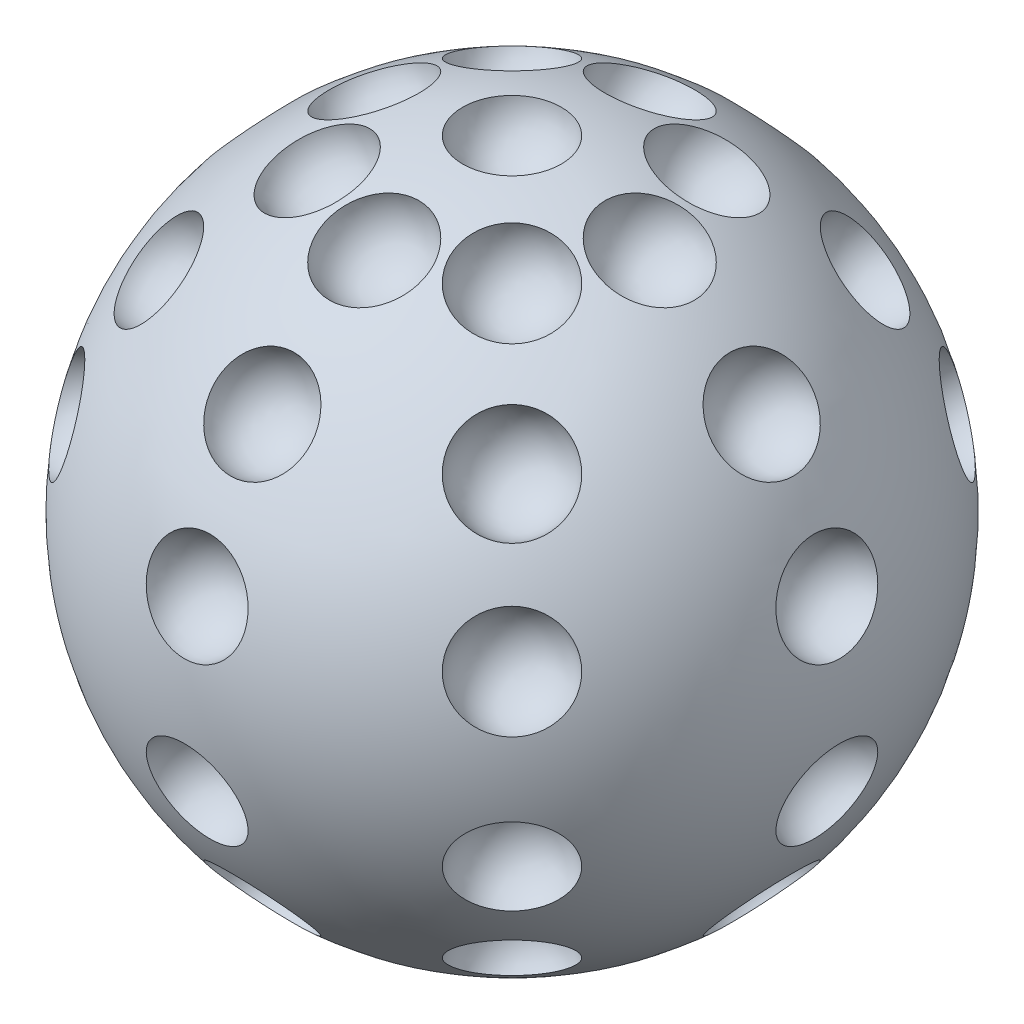
ISO-10303-21;
HEADER;
FILE_DESCRIPTION(('STEP AP214'),'2;1');
FILE_NAME('part.step','',(''),(''),'','','');
FILE_SCHEMA(('AUTOMOTIVE_DESIGN { 1 0 10303 214 1 1 1 1 }'));
ENDSEC;
DATA;
#1=APPLICATION_CONTEXT('core data for automotive mechanical design processes');
#2=APPLICATION_PROTOCOL_DEFINITION('international standard','automotive_design',2000,#1);
#3=PRODUCT_CONTEXT('',#1,'mechanical');
#4=PRODUCT('Part','Part','',(#3));
#5=PRODUCT_RELATED_PRODUCT_CATEGORY('part','',(#4));
#6=PRODUCT_DEFINITION_FORMATION('','',#4);
#7=PRODUCT_DEFINITION_CONTEXT('part definition',#1,'design');
#8=PRODUCT_DEFINITION('design','',#6,#7);
#9=PRODUCT_DEFINITION_SHAPE('','',#8);
#10=(LENGTH_UNIT() NAMED_UNIT(*) SI_UNIT(.MILLI.,.METRE.));
#11=(NAMED_UNIT(*) PLANE_ANGLE_UNIT() SI_UNIT($,.RADIAN.));
#12=(NAMED_UNIT(*) SI_UNIT($,.STERADIAN.) SOLID_ANGLE_UNIT());
#13=UNCERTAINTY_MEASURE_WITH_UNIT(LENGTH_MEASURE(1.E-05),#10,'distance_accuracy_value','');
#14=(GEOMETRIC_REPRESENTATION_CONTEXT(3) GLOBAL_UNCERTAINTY_ASSIGNED_CONTEXT((#13)) GLOBAL_UNIT_ASSIGNED_CONTEXT((#10,
#11,#12)) REPRESENTATION_CONTEXT('',''));
#15=CARTESIAN_POINT('',(0.,0.,0.));
#16=DIRECTION('',(0.,0.,1.));
#17=DIRECTION('',(1.,0.,0.));
#18=AXIS2_PLACEMENT_3D('',#15,#16,#17);
#19=CARTESIAN_POINT('',(0.,0.,0.));
#20=DIRECTION('',(0.,-1.,0.));
#21=DIRECTION('',(-1.,0.,0.));
#22=AXIS2_PLACEMENT_3D('',#19,#20,#21);
#23=SPHERICAL_SURFACE('',#22,20.);
#24=CARTESIAN_POINT('',(0.,19.775,0.));
#25=DIRECTION('',(0.,-1.,0.));
#26=DIRECTION('',(0.,0.,-1.));
#27=AXIS2_PLACEMENT_3D('',#24,#25,#26);
#28=CIRCLE('',#27,2.99155060127687);
#29=CARTESIAN_POINT('',(0.,19.775,-2.99155060127687));
#30=VERTEX_POINT('',#29);
#31=EDGE_CURVE('E10',#30,#30,#28,.T.);
#32=ORIENTED_EDGE('',*,*,#31,.T.);
#33=EDGE_LOOP('',(#32));
#34=FACE_BOUND('',#33,.T.);
#35=CARTESIAN_POINT('',(0.,17.9222364886498,8.35727612592235));
#36=DIRECTION('',(0.,-0.90630778703665,-0.4226182617407));
#37=DIRECTION('',(0.,0.4226182617407,-0.90630778703665));
#38=AXIS2_PLACEMENT_3D('',#35,#36,#37);
#39=CIRCLE('',#38,2.99155060127687);
#40=CARTESIAN_POINT('',(0.,19.1865204036707,5.64601052067095));
#41=VERTEX_POINT('',#40);
#42=EDGE_CURVE('E50',#41,#41,#39,.T.);
#43=ORIENTED_EDGE('',*,*,#42,.T.);
#44=EDGE_LOOP('',(#43));
#45=FACE_BOUND('',#44,.T.);
#46=CARTESIAN_POINT('',(0.,12.7111249815513,15.1485288626778));
#47=DIRECTION('',(0.,-0.642787609686538,-0.766044443118979));
#48=DIRECTION('',(0.,0.766044443118979,-0.642787609686538));
#49=AXIS2_PLACEMENT_3D('',#46,#47,#48);
#50=CIRCLE('',#49,2.99155060127687);
#51=CARTESIAN_POINT('',(0.,15.0027856959687,13.2255972024267));
#52=VERTEX_POINT('',#51);
#53=EDGE_CURVE('E55',#52,#52,#50,.T.);
#54=ORIENTED_EDGE('',*,*,#53,.T.);
#55=EDGE_LOOP('',(#54));
#56=FACE_BOUND('',#55,.T.);
#57=CARTESIAN_POINT('',(0.,5.1181466169023,19.1011832148663));
#58=DIRECTION('',(0.,-0.258819045102518,-0.965925826289069));
#59=DIRECTION('',(0.,0.965925826289069,-0.258819045102518));
#60=AXIS2_PLACEMENT_3D('',#57,#58,#59);
#61=CIRCLE('',#60,2.99155060127687);
#62=CARTESIAN_POINT('',(0.,8.00776260332622,18.326912944868));
#63=VERTEX_POINT('',#62);
#64=EDGE_CURVE('E60',#63,#63,#61,.T.);
#65=ORIENTED_EDGE('',*,*,#64,.T.);
#66=EDGE_LOOP('',(#65));
#67=FACE_BOUND('',#66,.T.);
#68=CARTESIAN_POINT('',(-5.90948662088814,17.9222364886497,5.90948662088812));
#69=DIRECTION('',(0.298836238730121,-0.90630778703665,-0.29883623873012));
#70=DIRECTION('',(0.640856382055789,0.4226182617407,-0.640856382055787));
#71=AXIS2_PLACEMENT_3D('',#68,#69,#70);
#72=CIRCLE('',#71,2.99155060127687);
#73=CARTESIAN_POINT('',(-3.99233232581702,19.1865204036707,3.99233232581701));
#74=VERTEX_POINT('',#73);
#75=EDGE_CURVE('E66',#74,#74,#72,.T.);
#76=ORIENTED_EDGE('',*,*,#75,.T.);
#77=EDGE_LOOP('',(#76));
#78=FACE_BOUND('',#77,.T.);
#79=CARTESIAN_POINT('',(-10.7116274837996,12.7111249815513,10.7116274837996));
#80=DIRECTION('',(0.541675220419704,-0.642787609686538,-0.541675220419702));
#81=DIRECTION('',(0.454519477672044,0.766044443118979,-0.454519477672042));
#82=AXIS2_PLACEMENT_3D('',#79,#80,#81);
#83=CIRCLE('',#82,2.99155060127687);
#84=CARTESIAN_POINT('',(-9.35190946707779,15.0027856959687,9.35190946707776));
#85=VERTEX_POINT('',#84);
#86=EDGE_CURVE('E70',#85,#85,#83,.T.);
#87=ORIENTED_EDGE('',*,*,#86,.T.);
#88=EDGE_LOOP('',(#87));
#89=FACE_BOUND('',#88,.T.);
#90=CARTESIAN_POINT('',(-13.5065761799187,5.1181466169023,13.5065761799186));
#91=DIRECTION('',(0.683012701892221,-0.258819045102518,-0.683012701892219));
#92=DIRECTION('',(0.183012701892218,0.965925826289069,-0.183012701892217));
#93=AXIS2_PLACEMENT_3D('',#90,#91,#92);
#94=CIRCLE('',#93,2.99155060127687);
#95=CARTESIAN_POINT('',(-12.9590844215317,8.00776260332622,12.9590844215317));
#96=VERTEX_POINT('',#95);
#97=EDGE_CURVE('E74',#96,#96,#94,.T.);
#98=ORIENTED_EDGE('',*,*,#97,.T.);
#99=EDGE_LOOP('',(#98));
#100=FACE_BOUND('',#99,.T.);
#101=CARTESIAN_POINT('',(-8.35727612592235,17.9222364886498,0.));
#102=DIRECTION('',(0.4226182617407,-0.90630778703665,0.));
#103=DIRECTION('',(0.90630778703665,0.4226182617407,0.));
#104=AXIS2_PLACEMENT_3D('',#101,#102,#103);
#105=CIRCLE('',#104,2.99155060127687);
#106=CARTESIAN_POINT('',(-5.64601052067095,19.1865204036707,0.));
#107=VERTEX_POINT('',#106);
#108=EDGE_CURVE('E78',#107,#107,#105,.T.);
#109=ORIENTED_EDGE('',*,*,#108,.T.);
#110=EDGE_LOOP('',(#109));
#111=FACE_BOUND('',#110,.T.);
#112=CARTESIAN_POINT('',(-15.1485288626778,12.7111249815513,0.));
#113=DIRECTION('',(0.766044443118979,-0.642787609686538,0.));
#114=DIRECTION('',(0.642787609686538,0.766044443118979,0.));
#115=AXIS2_PLACEMENT_3D('',#112,#113,#114);
#116=CIRCLE('',#115,2.99155060127687);
#117=CARTESIAN_POINT('',(-13.2255972024267,15.0027856959687,0.));
#118=VERTEX_POINT('',#117);
#119=EDGE_CURVE('E82',#118,#118,#116,.T.);
#120=ORIENTED_EDGE('',*,*,#119,.T.);
#121=EDGE_LOOP('',(#120));
#122=FACE_BOUND('',#121,.T.);
#123=CARTESIAN_POINT('',(-19.1011832148663,5.1181466169023,0.));
#124=DIRECTION('',(0.965925826289069,-0.258819045102518,0.));
#125=DIRECTION('',(0.258819045102518,0.965925826289069,0.));
#126=AXIS2_PLACEMENT_3D('',#123,#124,#125);
#127=CIRCLE('',#126,2.99155060127687);
#128=CARTESIAN_POINT('',(-18.326912944868,8.00776260332622,0.));
#129=VERTEX_POINT('',#128);
#130=EDGE_CURVE('E86',#129,#129,#127,.T.);
#131=ORIENTED_EDGE('',*,*,#130,.T.);
#132=EDGE_LOOP('',(#131));
#133=FACE_BOUND('',#132,.T.);
#134=CARTESIAN_POINT('',(-5.9094866208881,17.9222364886497,-5.90948662088816));
#135=DIRECTION('',(0.298836238730119,-0.90630778703665,0.298836238730122));
#136=DIRECTION('',(0.640856382055785,0.4226182617407,0.640856382055792));
#137=AXIS2_PLACEMENT_3D('',#134,#135,#136);
#138=CIRCLE('',#137,2.99155060127687);
#139=CARTESIAN_POINT('',(-3.992332325817,19.1865204036707,-3.99233232581704));
#140=VERTEX_POINT('',#139);
#141=EDGE_CURVE('E90',#140,#140,#138,.T.);
#142=ORIENTED_EDGE('',*,*,#141,.T.);
#143=EDGE_LOOP('',(#142));
#144=FACE_BOUND('',#143,.T.);
#145=CARTESIAN_POINT('',(-10.7116274837996,12.7111249815513,-10.7116274837997));
#146=DIRECTION('',(0.5416752204197,-0.642787609686538,0.541675220419706));
#147=DIRECTION('',(0.45451947767204,0.766044443118979,0.454519477672045));
#148=AXIS2_PLACEMENT_3D('',#145,#146,#147);
#149=CIRCLE('',#148,2.99155060127687);
#150=CARTESIAN_POINT('',(-9.35190946707772,15.0027856959687,-9.35190946707782));
#151=VERTEX_POINT('',#150);
#152=EDGE_CURVE('E94',#151,#151,#149,.T.);
#153=ORIENTED_EDGE('',*,*,#152,.T.);
#154=EDGE_LOOP('',(#153));
#155=FACE_BOUND('',#154,.T.);
#156=CARTESIAN_POINT('',(-13.5065761799186,5.1181466169023,-13.5065761799187));
#157=DIRECTION('',(0.683012701892216,-0.258819045102518,0.683012701892223));
#158=DIRECTION('',(0.183012701892217,0.965925826289069,0.183012701892219));
#159=AXIS2_PLACEMENT_3D('',#156,#157,#158);
#160=CIRCLE('',#159,2.99155060127687);
#161=CARTESIAN_POINT('',(-12.9590844215316,8.00776260332622,-12.9590844215317));
#162=VERTEX_POINT('',#161);
#163=EDGE_CURVE('E98',#162,#162,#160,.T.);
#164=ORIENTED_EDGE('',*,*,#163,.T.);
#165=EDGE_LOOP('',(#164));
#166=FACE_BOUND('',#165,.T.);
#167=CARTESIAN_POINT('',(0.,17.9222364886498,-8.35727612592235));
#168=DIRECTION('',(0.,-0.90630778703665,0.4226182617407));
#169=DIRECTION('',(0.,0.4226182617407,0.90630778703665));
#170=AXIS2_PLACEMENT_3D('',#167,#168,#169);
#171=CIRCLE('',#170,2.99155060127687);
#172=CARTESIAN_POINT('',(0.,19.1865204036707,-5.64601052067095));
#173=VERTEX_POINT('',#172);
#174=EDGE_CURVE('E102',#173,#173,#171,.T.);
#175=ORIENTED_EDGE('',*,*,#174,.T.);
#176=EDGE_LOOP('',(#175));
#177=FACE_BOUND('',#176,.T.);
#178=CARTESIAN_POINT('',(0.,12.7111249815513,-15.1485288626778));
#179=DIRECTION('',(0.,-0.642787609686538,0.766044443118979));
#180=DIRECTION('',(0.,0.766044443118979,0.642787609686538));
#181=AXIS2_PLACEMENT_3D('',#178,#179,#180);
#182=CIRCLE('',#181,2.99155060127687);
#183=CARTESIAN_POINT('',(0.,15.0027856959687,-13.2255972024267));
#184=VERTEX_POINT('',#183);
#185=EDGE_CURVE('E106',#184,#184,#182,.T.);
#186=ORIENTED_EDGE('',*,*,#185,.T.);
#187=EDGE_LOOP('',(#186));
#188=FACE_BOUND('',#187,.T.);
#189=CARTESIAN_POINT('',(0.,5.1181466169023,-19.1011832148663));
#190=DIRECTION('',(0.,-0.258819045102518,0.965925826289069));
#191=DIRECTION('',(0.,0.965925826289069,0.258819045102518));
#192=AXIS2_PLACEMENT_3D('',#189,#190,#191);
#193=CIRCLE('',#192,2.99155060127687);
#194=CARTESIAN_POINT('',(0.,8.00776260332622,-18.326912944868));
#195=VERTEX_POINT('',#194);
#196=EDGE_CURVE('E110',#195,#195,#193,.T.);
#197=ORIENTED_EDGE('',*,*,#196,.T.);
#198=EDGE_LOOP('',(#197));
#199=FACE_BOUND('',#198,.T.);
#200=CARTESIAN_POINT('',(5.90948662088818,17.9222364886498,-5.90948662088808));
#201=DIRECTION('',(-0.298836238730123,-0.90630778703665,0.298836238730118));
#202=DIRECTION('',(-0.640856382055794,0.4226182617407,0.640856382055783));
#203=AXIS2_PLACEMENT_3D('',#200,#201,#202);
#204=CIRCLE('',#203,2.99155060127687);
#205=CARTESIAN_POINT('',(3.99233232581705,19.1865204036707,-3.99233232581698));
#206=VERTEX_POINT('',#205);
#207=EDGE_CURVE('E114',#206,#206,#204,.T.);
#208=ORIENTED_EDGE('',*,*,#207,.T.);
#209=EDGE_LOOP('',(#208));
#210=FACE_BOUND('',#209,.T.);
#211=CARTESIAN_POINT('',(10.7116274837997,12.7111249815513,-10.7116274837995));
#212=DIRECTION('',(-0.541675220419707,-0.642787609686538,0.541675220419698));
#213=DIRECTION('',(-0.454519477672047,0.766044443118979,0.454519477672039));
#214=AXIS2_PLACEMENT_3D('',#211,#212,#213);
#215=CIRCLE('',#214,2.99155060127687);
#216=CARTESIAN_POINT('',(9.35190946707785,15.0027856959687,-9.35190946707769));
#217=VERTEX_POINT('',#216);
#218=EDGE_CURVE('E118',#217,#217,#215,.T.);
#219=ORIENTED_EDGE('',*,*,#218,.T.);
#220=EDGE_LOOP('',(#219));
#221=FACE_BOUND('',#220,.T.);
#222=CARTESIAN_POINT('',(13.5065761799188,5.1181466169023,-13.5065761799185));
#223=DIRECTION('',(-0.683012701892226,-0.258819045102518,0.683012701892214));
#224=DIRECTION('',(-0.183012701892219,0.965925826289069,0.183012701892216));
#225=AXIS2_PLACEMENT_3D('',#222,#223,#224);
#226=CIRCLE('',#225,2.99155060127687);
#227=CARTESIAN_POINT('',(12.9590844215318,8.00776260332622,-12.9590844215316));
#228=VERTEX_POINT('',#227);
#229=EDGE_CURVE('E122',#228,#228,#226,.T.);
#230=ORIENTED_EDGE('',*,*,#229,.T.);
#231=EDGE_LOOP('',(#230));
#232=FACE_BOUND('',#231,.T.);
#233=CARTESIAN_POINT('',(8.35727612592235,17.9222364886498,0.));
#234=DIRECTION('',(-0.4226182617407,-0.90630778703665,0.));
#235=DIRECTION('',(-0.90630778703665,0.4226182617407,0.));
#236=AXIS2_PLACEMENT_3D('',#233,#234,#235);
#237=CIRCLE('',#236,2.99155060127687);
#238=CARTESIAN_POINT('',(5.64601052067095,19.1865204036707,0.));
#239=VERTEX_POINT('',#238);
#240=EDGE_CURVE('E126',#239,#239,#237,.T.);
#241=ORIENTED_EDGE('',*,*,#240,.T.);
#242=EDGE_LOOP('',(#241));
#243=FACE_BOUND('',#242,.T.);
#244=CARTESIAN_POINT('',(15.1485288626778,12.7111249815513,1.58672417504899E-13));
#245=DIRECTION('',(-0.766044443118979,-0.642787609686538,0.));
#246=DIRECTION('',(-0.642787609686538,0.766044443118979,0.));
#247=AXIS2_PLACEMENT_3D('',#244,#245,#246);
#248=CIRCLE('',#247,2.99155060127687);
#249=CARTESIAN_POINT('',(13.2255972024267,15.0027856959687,1.38530777481987E-13));
#250=VERTEX_POINT('',#249);
#251=EDGE_CURVE('E130',#250,#250,#248,.T.);
#252=ORIENTED_EDGE('',*,*,#251,.T.);
#253=EDGE_LOOP('',(#252));
#254=FACE_BOUND('',#253,.T.);
#255=CARTESIAN_POINT('',(19.1011832148663,5.1181466169023,2.00074274233589E-13));
#256=DIRECTION('',(-0.965925826289069,-0.258819045102518,0.));
#257=DIRECTION('',(-0.258819045102518,0.965925826289069,0.));
#258=AXIS2_PLACEMENT_3D('',#255,#256,#257);
#259=CIRCLE('',#258,2.99155060127687);
#260=CARTESIAN_POINT('',(18.326912944868,8.00776260332622,1.91964223636828E-13));
#261=VERTEX_POINT('',#260);
#262=EDGE_CURVE('E134',#261,#261,#259,.T.);
#263=ORIENTED_EDGE('',*,*,#262,.T.);
#264=EDGE_LOOP('',(#263));
#265=FACE_BOUND('',#264,.T.);
#266=CARTESIAN_POINT('',(5.90948662088806,17.9222364886498,5.9094866208882));
#267=DIRECTION('',(-0.298836238730117,-0.90630778703665,-0.298836238730124));
#268=DIRECTION('',(-0.640856382055781,0.4226182617407,-0.640856382055796));
#269=AXIS2_PLACEMENT_3D('',#266,#267,#268);
#270=CIRCLE('',#269,2.99155060127687);
#271=CARTESIAN_POINT('',(3.99233232581697,19.1865204036707,3.99233232581707));
#272=VERTEX_POINT('',#271);
#273=EDGE_CURVE('E138',#272,#272,#270,.T.);
#274=ORIENTED_EDGE('',*,*,#273,.T.);
#275=EDGE_LOOP('',(#274));
#276=FACE_BOUND('',#275,.T.);
#277=CARTESIAN_POINT('',(10.7116274837995,12.7111249815513,10.7116274837998));
#278=DIRECTION('',(-0.541675220419696,-0.642787609686538,-0.541675220419709));
#279=DIRECTION('',(-0.454519477672037,0.766044443118979,-0.454519477672048));
#280=AXIS2_PLACEMENT_3D('',#277,#278,#279);
#281=CIRCLE('',#280,2.99155060127687);
#282=CARTESIAN_POINT('',(9.35190946707766,15.0027856959687,9.35190946707788));
#283=VERTEX_POINT('',#282);
#284=EDGE_CURVE('E142',#283,#283,#281,.T.);
#285=ORIENTED_EDGE('',*,*,#284,.T.);
#286=EDGE_LOOP('',(#285));
#287=FACE_BOUND('',#286,.T.);
#288=CARTESIAN_POINT('',(13.5065761799185,5.1181466169023,13.5065761799188));
#289=DIRECTION('',(-0.683012701892212,-0.258819045102518,-0.683012701892228));
#290=DIRECTION('',(-0.183012701892215,0.965925826289069,-0.18301270189222));
#291=AXIS2_PLACEMENT_3D('',#288,#289,#290);
#292=CIRCLE('',#291,2.99155060127687);
#293=CARTESIAN_POINT('',(12.9590844215315,8.00776260332622,12.9590844215318));
#294=VERTEX_POINT('',#293);
#295=EDGE_CURVE('E146',#294,#294,#292,.T.);
#296=ORIENTED_EDGE('',*,*,#295,.T.);
#297=EDGE_LOOP('',(#296));
#298=FACE_BOUND('',#297,.T.);
#299=CARTESIAN_POINT('',(0.,-19.775,0.));
#300=DIRECTION('',(0.,-1.,0.));
#301=DIRECTION('',(0.,0.,-1.));
#302=AXIS2_PLACEMENT_3D('',#299,#300,#301);
#303=CIRCLE('',#302,2.99155060127687);
#304=CARTESIAN_POINT('',(0.,-19.775,-2.99155060127687));
#305=VERTEX_POINT('',#304);
#306=EDGE_CURVE('E150',#305,#305,#303,.T.);
#307=ORIENTED_EDGE('',*,*,#306,.F.);
#308=EDGE_LOOP('',(#307));
#309=FACE_BOUND('',#308,.T.);
#310=CARTESIAN_POINT('',(0.,-17.9222364886498,8.35727612592235));
#311=DIRECTION('',(0.,-0.90630778703665,0.4226182617407));
#312=DIRECTION('',(0.,-0.4226182617407,-0.90630778703665));
#313=AXIS2_PLACEMENT_3D('',#310,#311,#312);
#314=CIRCLE('',#313,2.99155060127687);
#315=CARTESIAN_POINT('',(0.,-19.1865204036707,5.64601052067095));
#316=VERTEX_POINT('',#315);
#317=EDGE_CURVE('E154',#316,#316,#314,.T.);
#318=ORIENTED_EDGE('',*,*,#317,.F.);
#319=EDGE_LOOP('',(#318));
#320=FACE_BOUND('',#319,.T.);
#321=CARTESIAN_POINT('',(0.,-12.7111249815513,15.1485288626778));
#322=DIRECTION('',(0.,-0.642787609686538,0.766044443118979));
#323=DIRECTION('',(0.,-0.766044443118979,-0.642787609686538));
#324=AXIS2_PLACEMENT_3D('',#321,#322,#323);
#325=CIRCLE('',#324,2.99155060127687);
#326=CARTESIAN_POINT('',(0.,-15.0027856959687,13.2255972024267));
#327=VERTEX_POINT('',#326);
#328=EDGE_CURVE('E158',#327,#327,#325,.T.);
#329=ORIENTED_EDGE('',*,*,#328,.F.);
#330=EDGE_LOOP('',(#329));
#331=FACE_BOUND('',#330,.T.);
#332=CARTESIAN_POINT('',(0.,-5.1181466169023,19.1011832148663));
#333=DIRECTION('',(0.,-0.258819045102518,0.965925826289069));
#334=DIRECTION('',(0.,-0.965925826289069,-0.258819045102518));
#335=AXIS2_PLACEMENT_3D('',#332,#333,#334);
#336=CIRCLE('',#335,2.99155060127687);
#337=CARTESIAN_POINT('',(0.,-8.00776260332622,18.326912944868));
#338=VERTEX_POINT('',#337);
#339=EDGE_CURVE('E162',#338,#338,#336,.T.);
#340=ORIENTED_EDGE('',*,*,#339,.F.);
#341=EDGE_LOOP('',(#340));
#342=FACE_BOUND('',#341,.T.);
#343=CARTESIAN_POINT('',(-5.90948662088814,-17.9222364886497,5.90948662088812));
#344=DIRECTION('',(-0.298836238730121,-0.90630778703665,0.29883623873012));
#345=DIRECTION('',(0.640856382055789,-0.4226182617407,-0.640856382055787));
#346=AXIS2_PLACEMENT_3D('',#343,#344,#345);
#347=CIRCLE('',#346,2.99155060127687);
#348=CARTESIAN_POINT('',(-3.99233232581702,-19.1865204036707,3.99233232581701));
#349=VERTEX_POINT('',#348);
#350=EDGE_CURVE('E166',#349,#349,#347,.T.);
#351=ORIENTED_EDGE('',*,*,#350,.F.);
#352=EDGE_LOOP('',(#351));
#353=FACE_BOUND('',#352,.T.);
#354=CARTESIAN_POINT('',(-10.7116274837996,-12.7111249815513,10.7116274837996));
#355=DIRECTION('',(-0.541675220419704,-0.642787609686538,0.541675220419702));
#356=DIRECTION('',(0.454519477672044,-0.766044443118979,-0.454519477672042));
#357=AXIS2_PLACEMENT_3D('',#354,#355,#356);
#358=CIRCLE('',#357,2.99155060127687);
#359=CARTESIAN_POINT('',(-9.35190946707779,-15.0027856959687,9.35190946707776));
#360=VERTEX_POINT('',#359);
#361=EDGE_CURVE('E170',#360,#360,#358,.T.);
#362=ORIENTED_EDGE('',*,*,#361,.F.);
#363=EDGE_LOOP('',(#362));
#364=FACE_BOUND('',#363,.T.);
#365=CARTESIAN_POINT('',(-13.5065761799187,-5.1181466169023,13.5065761799186));
#366=DIRECTION('',(-0.683012701892221,-0.258819045102518,0.683012701892219));
#367=DIRECTION('',(0.183012701892218,-0.965925826289069,-0.183012701892217));
#368=AXIS2_PLACEMENT_3D('',#365,#366,#367);
#369=CIRCLE('',#368,2.99155060127687);
#370=CARTESIAN_POINT('',(-12.9590844215317,-8.00776260332622,12.9590844215317));
#371=VERTEX_POINT('',#370);
#372=EDGE_CURVE('E174',#371,#371,#369,.T.);
#373=ORIENTED_EDGE('',*,*,#372,.F.);
#374=EDGE_LOOP('',(#373));
#375=FACE_BOUND('',#374,.T.);
#376=CARTESIAN_POINT('',(-8.35727612592235,-17.9222364886498,0.));
#377=DIRECTION('',(-0.4226182617407,-0.90630778703665,0.));
#378=DIRECTION('',(0.90630778703665,-0.4226182617407,0.));
#379=AXIS2_PLACEMENT_3D('',#376,#377,#378);
#380=CIRCLE('',#379,2.99155060127687);
#381=CARTESIAN_POINT('',(-5.64601052067095,-19.1865204036707,0.));
#382=VERTEX_POINT('',#381);
#383=EDGE_CURVE('E178',#382,#382,#380,.T.);
#384=ORIENTED_EDGE('',*,*,#383,.F.);
#385=EDGE_LOOP('',(#384));
#386=FACE_BOUND('',#385,.T.);
#387=CARTESIAN_POINT('',(-15.1485288626778,-12.7111249815513,0.));
#388=DIRECTION('',(-0.766044443118979,-0.642787609686538,0.));
#389=DIRECTION('',(0.642787609686538,-0.766044443118979,0.));
#390=AXIS2_PLACEMENT_3D('',#387,#388,#389);
#391=CIRCLE('',#390,2.99155060127687);
#392=CARTESIAN_POINT('',(-13.2255972024267,-15.0027856959687,0.));
#393=VERTEX_POINT('',#392);
#394=EDGE_CURVE('E182',#393,#393,#391,.T.);
#395=ORIENTED_EDGE('',*,*,#394,.F.);
#396=EDGE_LOOP('',(#395));
#397=FACE_BOUND('',#396,.T.);
#398=CARTESIAN_POINT('',(-19.1011832148663,-5.1181466169023,0.));
#399=DIRECTION('',(-0.965925826289069,-0.258819045102518,0.));
#400=DIRECTION('',(0.258819045102518,-0.965925826289069,0.));
#401=AXIS2_PLACEMENT_3D('',#398,#399,#400);
#402=CIRCLE('',#401,2.99155060127687);
#403=CARTESIAN_POINT('',(-18.326912944868,-8.00776260332622,0.));
#404=VERTEX_POINT('',#403);
#405=EDGE_CURVE('E186',#404,#404,#402,.T.);
#406=ORIENTED_EDGE('',*,*,#405,.F.);
#407=EDGE_LOOP('',(#406));
#408=FACE_BOUND('',#407,.T.);
#409=CARTESIAN_POINT('',(-5.9094866208881,-17.9222364886497,-5.90948662088816));
#410=DIRECTION('',(-0.298836238730119,-0.90630778703665,-0.298836238730122));
#411=DIRECTION('',(0.640856382055785,-0.4226182617407,0.640856382055792));
#412=AXIS2_PLACEMENT_3D('',#409,#410,#411);
#413=CIRCLE('',#412,2.99155060127687);
#414=CARTESIAN_POINT('',(-3.992332325817,-19.1865204036707,-3.99233232581704));
#415=VERTEX_POINT('',#414);
#416=EDGE_CURVE('E190',#415,#415,#413,.T.);
#417=ORIENTED_EDGE('',*,*,#416,.F.);
#418=EDGE_LOOP('',(#417));
#419=FACE_BOUND('',#418,.T.);
#420=CARTESIAN_POINT('',(-10.7116274837996,-12.7111249815513,-10.7116274837997));
#421=DIRECTION('',(-0.5416752204197,-0.642787609686538,-0.541675220419706));
#422=DIRECTION('',(0.45451947767204,-0.766044443118979,0.454519477672045));
#423=AXIS2_PLACEMENT_3D('',#420,#421,#422);
#424=CIRCLE('',#423,2.99155060127687);
#425=CARTESIAN_POINT('',(-9.35190946707772,-15.0027856959687,-9.35190946707782));
#426=VERTEX_POINT('',#425);
#427=EDGE_CURVE('E194',#426,#426,#424,.T.);
#428=ORIENTED_EDGE('',*,*,#427,.F.);
#429=EDGE_LOOP('',(#428));
#430=FACE_BOUND('',#429,.T.);
#431=CARTESIAN_POINT('',(-13.5065761799186,-5.1181466169023,-13.5065761799187));
#432=DIRECTION('',(-0.683012701892216,-0.258819045102518,-0.683012701892223));
#433=DIRECTION('',(0.183012701892217,-0.965925826289069,0.183012701892219));
#434=AXIS2_PLACEMENT_3D('',#431,#432,#433);
#435=CIRCLE('',#434,2.99155060127687);
#436=CARTESIAN_POINT('',(-12.9590844215316,-8.00776260332622,-12.9590844215317));
#437=VERTEX_POINT('',#436);
#438=EDGE_CURVE('E198',#437,#437,#435,.T.);
#439=ORIENTED_EDGE('',*,*,#438,.F.);
#440=EDGE_LOOP('',(#439));
#441=FACE_BOUND('',#440,.T.);
#442=CARTESIAN_POINT('',(0.,-17.9222364886498,-8.35727612592235));
#443=DIRECTION('',(0.,-0.90630778703665,-0.4226182617407));
#444=DIRECTION('',(0.,-0.4226182617407,0.90630778703665));
#445=AXIS2_PLACEMENT_3D('',#442,#443,#444);
#446=CIRCLE('',#445,2.99155060127687);
#447=CARTESIAN_POINT('',(0.,-19.1865204036707,-5.64601052067095));
#448=VERTEX_POINT('',#447);
#449=EDGE_CURVE('E202',#448,#448,#446,.T.);
#450=ORIENTED_EDGE('',*,*,#449,.F.);
#451=EDGE_LOOP('',(#450));
#452=FACE_BOUND('',#451,.T.);
#453=CARTESIAN_POINT('',(0.,-12.7111249815513,-15.1485288626778));
#454=DIRECTION('',(0.,-0.642787609686538,-0.766044443118979));
#455=DIRECTION('',(0.,-0.766044443118979,0.642787609686538));
#456=AXIS2_PLACEMENT_3D('',#453,#454,#455);
#457=CIRCLE('',#456,2.99155060127687);
#458=CARTESIAN_POINT('',(0.,-15.0027856959687,-13.2255972024267));
#459=VERTEX_POINT('',#458);
#460=EDGE_CURVE('E206',#459,#459,#457,.T.);
#461=ORIENTED_EDGE('',*,*,#460,.F.);
#462=EDGE_LOOP('',(#461));
#463=FACE_BOUND('',#462,.T.);
#464=CARTESIAN_POINT('',(0.,-5.1181466169023,-19.1011832148663));
#465=DIRECTION('',(0.,-0.258819045102518,-0.965925826289069));
#466=DIRECTION('',(0.,-0.965925826289069,0.258819045102518));
#467=AXIS2_PLACEMENT_3D('',#464,#465,#466);
#468=CIRCLE('',#467,2.99155060127687);
#469=CARTESIAN_POINT('',(0.,-8.00776260332622,-18.326912944868));
#470=VERTEX_POINT('',#469);
#471=EDGE_CURVE('E210',#470,#470,#468,.T.);
#472=ORIENTED_EDGE('',*,*,#471,.F.);
#473=EDGE_LOOP('',(#472));
#474=FACE_BOUND('',#473,.T.);
#475=CARTESIAN_POINT('',(5.90948662088818,-17.9222364886498,-5.90948662088808));
#476=DIRECTION('',(0.298836238730123,-0.90630778703665,-0.298836238730118));
#477=DIRECTION('',(-0.640856382055794,-0.4226182617407,0.640856382055783));
#478=AXIS2_PLACEMENT_3D('',#475,#476,#477);
#479=CIRCLE('',#478,2.99155060127687);
#480=CARTESIAN_POINT('',(3.99233232581705,-19.1865204036707,-3.99233232581698));
#481=VERTEX_POINT('',#480);
#482=EDGE_CURVE('E214',#481,#481,#479,.T.);
#483=ORIENTED_EDGE('',*,*,#482,.F.);
#484=EDGE_LOOP('',(#483));
#485=FACE_BOUND('',#484,.T.);
#486=CARTESIAN_POINT('',(10.7116274837997,-12.7111249815513,-10.7116274837995));
#487=DIRECTION('',(0.541675220419707,-0.642787609686538,-0.541675220419698));
#488=DIRECTION('',(-0.454519477672047,-0.766044443118979,0.454519477672039));
#489=AXIS2_PLACEMENT_3D('',#486,#487,#488);
#490=CIRCLE('',#489,2.99155060127687);
#491=CARTESIAN_POINT('',(9.35190946707785,-15.0027856959687,-9.35190946707769));
#492=VERTEX_POINT('',#491);
#493=EDGE_CURVE('E218',#492,#492,#490,.T.);
#494=ORIENTED_EDGE('',*,*,#493,.F.);
#495=EDGE_LOOP('',(#494));
#496=FACE_BOUND('',#495,.T.);
#497=CARTESIAN_POINT('',(13.5065761799188,-5.1181466169023,-13.5065761799185));
#498=DIRECTION('',(0.683012701892226,-0.258819045102518,-0.683012701892214));
#499=DIRECTION('',(-0.183012701892219,-0.965925826289069,0.183012701892216));
#500=AXIS2_PLACEMENT_3D('',#497,#498,#499);
#501=CIRCLE('',#500,2.99155060127687);
#502=CARTESIAN_POINT('',(12.9590844215318,-8.00776260332622,-12.9590844215316));
#503=VERTEX_POINT('',#502);
#504=EDGE_CURVE('E222',#503,#503,#501,.T.);
#505=ORIENTED_EDGE('',*,*,#504,.F.);
#506=EDGE_LOOP('',(#505));
#507=FACE_BOUND('',#506,.T.);
#508=CARTESIAN_POINT('',(8.35727612592235,-17.9222364886498,0.));
#509=DIRECTION('',(0.4226182617407,-0.90630778703665,0.));
#510=DIRECTION('',(-0.90630778703665,-0.4226182617407,0.));
#511=AXIS2_PLACEMENT_3D('',#508,#509,#510);
#512=CIRCLE('',#511,2.99155060127687);
#513=CARTESIAN_POINT('',(5.64601052067095,-19.1865204036707,0.));
#514=VERTEX_POINT('',#513);
#515=EDGE_CURVE('E226',#514,#514,#512,.T.);
#516=ORIENTED_EDGE('',*,*,#515,.F.);
#517=EDGE_LOOP('',(#516));
#518=FACE_BOUND('',#517,.T.);
#519=CARTESIAN_POINT('',(15.1485288626778,-12.7111249815513,1.58672417504899E-13));
#520=DIRECTION('',(0.766044443118979,-0.642787609686538,0.));
#521=DIRECTION('',(-0.642787609686538,-0.766044443118979,0.));
#522=AXIS2_PLACEMENT_3D('',#519,#520,#521);
#523=CIRCLE('',#522,2.99155060127687);
#524=CARTESIAN_POINT('',(13.2255972024267,-15.0027856959687,1.38530777481987E-13));
#525=VERTEX_POINT('',#524);
#526=EDGE_CURVE('E230',#525,#525,#523,.T.);
#527=ORIENTED_EDGE('',*,*,#526,.F.);
#528=EDGE_LOOP('',(#527));
#529=FACE_BOUND('',#528,.T.);
#530=CARTESIAN_POINT('',(19.1011832148663,-5.1181466169023,2.00074274233589E-13));
#531=DIRECTION('',(0.965925826289069,-0.258819045102518,0.));
#532=DIRECTION('',(-0.258819045102518,-0.965925826289069,0.));
#533=AXIS2_PLACEMENT_3D('',#530,#531,#532);
#534=CIRCLE('',#533,2.99155060127687);
#535=CARTESIAN_POINT('',(18.326912944868,-8.00776260332622,1.91964223636828E-13));
#536=VERTEX_POINT('',#535);
#537=EDGE_CURVE('E234',#536,#536,#534,.T.);
#538=ORIENTED_EDGE('',*,*,#537,.F.);
#539=EDGE_LOOP('',(#538));
#540=FACE_BOUND('',#539,.T.);
#541=CARTESIAN_POINT('',(5.90948662088806,-17.9222364886498,5.9094866208882));
#542=DIRECTION('',(0.298836238730117,-0.90630778703665,0.298836238730124));
#543=DIRECTION('',(-0.640856382055781,-0.4226182617407,-0.640856382055796));
#544=AXIS2_PLACEMENT_3D('',#541,#542,#543);
#545=CIRCLE('',#544,2.99155060127687);
#546=CARTESIAN_POINT('',(3.99233232581697,-19.1865204036707,3.99233232581707));
#547=VERTEX_POINT('',#546);
#548=EDGE_CURVE('E238',#547,#547,#545,.T.);
#549=ORIENTED_EDGE('',*,*,#548,.F.);
#550=EDGE_LOOP('',(#549));
#551=FACE_BOUND('',#550,.T.);
#552=CARTESIAN_POINT('',(10.7116274837995,-12.7111249815513,10.7116274837998));
#553=DIRECTION('',(0.541675220419696,-0.642787609686538,0.541675220419709));
#554=DIRECTION('',(-0.454519477672037,-0.766044443118979,-0.454519477672048));
#555=AXIS2_PLACEMENT_3D('',#552,#553,#554);
#556=CIRCLE('',#555,2.99155060127687);
#557=CARTESIAN_POINT('',(9.35190946707766,-15.0027856959687,9.35190946707788));
#558=VERTEX_POINT('',#557);
#559=EDGE_CURVE('E242',#558,#558,#556,.T.);
#560=ORIENTED_EDGE('',*,*,#559,.F.);
#561=EDGE_LOOP('',(#560));
#562=FACE_BOUND('',#561,.T.);
#563=CARTESIAN_POINT('',(13.5065761799185,-5.1181466169023,13.5065761799188));
#564=DIRECTION('',(0.683012701892212,-0.258819045102518,0.683012701892228));
#565=DIRECTION('',(-0.183012701892215,-0.965925826289069,-0.18301270189222));
#566=AXIS2_PLACEMENT_3D('',#563,#564,#565);
#567=CIRCLE('',#566,2.99155060127687);
#568=CARTESIAN_POINT('',(12.9590844215315,-8.00776260332622,12.9590844215318));
#569=VERTEX_POINT('',#568);
#570=EDGE_CURVE('E246',#569,#569,#567,.T.);
#571=ORIENTED_EDGE('',*,*,#570,.F.);
#572=EDGE_LOOP('',(#571));
#573=FACE_BOUND('',#572,.T.);
#574=ADVANCED_FACE('F43',(#34,#45,#56,#67,#78,#89,#100,#111,#122,#133,#144,#155,#166,#177,#188,
#199,#210,#221,#232,#243,#254,#265,#276,#287,#298,#309,#320,#331,#342,#353,#364,#375,#386,#397,
#408,#419,#430,#441,#452,#463,#474,#485,#496,#507,#518,#529,#540,#551,#562,#573),#23,.T.);
#575=CARTESIAN_POINT('',(0.,20.,0.));
#576=DIRECTION('',(0.,-1.,0.));
#577=DIRECTION('',(0.,0.,1.));
#578=AXIS2_PLACEMENT_3D('',#575,#576,#577);
#579=SPHERICAL_SURFACE('',#578,3.);
#580=ORIENTED_EDGE('',*,*,#31,.F.);
#581=EDGE_LOOP('',(#580));
#582=FACE_BOUND('',#581,.T.);
#583=ADVANCED_FACE('F254',(#582),#579,.F.);
#584=CARTESIAN_POINT('',(0.,18.126155740733,8.45236523481401));
#585=DIRECTION('',(0.,-0.90630778703665,-0.4226182617407));
#586=DIRECTION('',(0.,-0.4226182617407,0.90630778703665));
#587=AXIS2_PLACEMENT_3D('',#584,#585,#586);
#588=SPHERICAL_SURFACE('',#587,3.);
#589=ORIENTED_EDGE('',*,*,#42,.F.);
#590=EDGE_LOOP('',(#589));
#591=FACE_BOUND('',#590,.T.);
#592=ADVANCED_FACE('F258',(#591),#588,.F.);
#593=CARTESIAN_POINT('',(0.,12.8557521937308,15.3208888623796));
#594=DIRECTION('',(0.,-0.642787609686538,-0.766044443118979));
#595=DIRECTION('',(0.,-0.766044443118979,0.642787609686538));
#596=AXIS2_PLACEMENT_3D('',#593,#594,#595);
#597=SPHERICAL_SURFACE('',#596,3.);
#598=ORIENTED_EDGE('',*,*,#53,.F.);
#599=EDGE_LOOP('',(#598));
#600=FACE_BOUND('',#599,.T.);
#601=ADVANCED_FACE('F542',(#600),#597,.F.);
#602=CARTESIAN_POINT('',(0.,5.17638090205037,19.3185165257814));
#603=DIRECTION('',(0.,-0.258819045102518,-0.965925826289069));
#604=DIRECTION('',(0.,-0.965925826289069,0.258819045102518));
#605=AXIS2_PLACEMENT_3D('',#602,#603,#604);
#606=SPHERICAL_SURFACE('',#605,3.);
#607=ORIENTED_EDGE('',*,*,#64,.F.);
#608=EDGE_LOOP('',(#607));
#609=FACE_BOUND('',#608,.T.);
#610=ADVANCED_FACE('F538',(#609),#606,.F.);
#611=CARTESIAN_POINT('',(-5.97672477460242,18.126155740733,5.9767247746024));
#612=DIRECTION('',(0.298836238730121,-0.90630778703665,-0.29883623873012));
#613=DIRECTION('',(-0.640856382055789,-0.4226182617407,0.640856382055787));
#614=AXIS2_PLACEMENT_3D('',#611,#612,#613);
#615=SPHERICAL_SURFACE('',#614,3.);
#616=ORIENTED_EDGE('',*,*,#75,.F.);
#617=EDGE_LOOP('',(#616));
#618=FACE_BOUND('',#617,.T.);
#619=ADVANCED_FACE('F534',(#618),#615,.F.);
#620=CARTESIAN_POINT('',(-10.8335044083941,12.8557521937308,10.833504408394));
#621=DIRECTION('',(0.541675220419704,-0.642787609686538,-0.541675220419702));
#622=DIRECTION('',(-0.454519477672044,-0.766044443118979,0.454519477672042));
#623=AXIS2_PLACEMENT_3D('',#620,#621,#622);
#624=SPHERICAL_SURFACE('',#623,3.);
#625=ORIENTED_EDGE('',*,*,#86,.F.);
#626=EDGE_LOOP('',(#625));
#627=FACE_BOUND('',#626,.T.);
#628=ADVANCED_FACE('F530',(#627),#624,.F.);
#629=CARTESIAN_POINT('',(-13.6602540378444,5.17638090205037,13.6602540378444));
#630=DIRECTION('',(0.683012701892221,-0.258819045102518,-0.683012701892219));
#631=DIRECTION('',(-0.183012701892218,-0.965925826289069,0.183012701892217));
#632=AXIS2_PLACEMENT_3D('',#629,#630,#631);
#633=SPHERICAL_SURFACE('',#632,3.);
#634=ORIENTED_EDGE('',*,*,#97,.F.);
#635=EDGE_LOOP('',(#634));
#636=FACE_BOUND('',#635,.T.);
#637=ADVANCED_FACE('F526',(#636),#633,.F.);
#638=CARTESIAN_POINT('',(-8.45236523481401,18.126155740733,0.));
#639=DIRECTION('',(0.4226182617407,-0.90630778703665,0.));
#640=DIRECTION('',(-0.90630778703665,-0.4226182617407,0.));
#641=AXIS2_PLACEMENT_3D('',#638,#639,#640);
#642=SPHERICAL_SURFACE('',#641,3.);
#643=ORIENTED_EDGE('',*,*,#108,.F.);
#644=EDGE_LOOP('',(#643));
#645=FACE_BOUND('',#644,.T.);
#646=ADVANCED_FACE('F522',(#645),#642,.F.);
#647=CARTESIAN_POINT('',(-15.3208888623796,12.8557521937308,0.));
#648=DIRECTION('',(0.766044443118979,-0.642787609686538,0.));
#649=DIRECTION('',(-0.642787609686538,-0.766044443118979,0.));
#650=AXIS2_PLACEMENT_3D('',#647,#648,#649);
#651=SPHERICAL_SURFACE('',#650,3.);
#652=ORIENTED_EDGE('',*,*,#119,.F.);
#653=EDGE_LOOP('',(#652));
#654=FACE_BOUND('',#653,.T.);
#655=ADVANCED_FACE('F518',(#654),#651,.F.);
#656=CARTESIAN_POINT('',(-19.3185165257814,5.17638090205037,0.));
#657=DIRECTION('',(0.965925826289069,-0.258819045102518,0.));
#658=DIRECTION('',(-0.258819045102518,-0.965925826289069,0.));
#659=AXIS2_PLACEMENT_3D('',#656,#657,#658);
#660=SPHERICAL_SURFACE('',#659,3.);
#661=ORIENTED_EDGE('',*,*,#130,.F.);
#662=EDGE_LOOP('',(#661));
#663=FACE_BOUND('',#662,.T.);
#664=ADVANCED_FACE('F514',(#663),#660,.F.);
#665=CARTESIAN_POINT('',(-5.97672477460238,18.126155740733,-5.97672477460244));
#666=DIRECTION('',(0.298836238730119,-0.90630778703665,0.298836238730122));
#667=DIRECTION('',(-0.640856382055785,-0.4226182617407,-0.640856382055792));
#668=AXIS2_PLACEMENT_3D('',#665,#666,#667);
#669=SPHERICAL_SURFACE('',#668,3.);
#670=ORIENTED_EDGE('',*,*,#141,.F.);
#671=EDGE_LOOP('',(#670));
#672=FACE_BOUND('',#671,.T.);
#673=ADVANCED_FACE('F510',(#672),#669,.F.);
#674=CARTESIAN_POINT('',(-10.833504408394,12.8557521937308,-10.8335044083941));
#675=DIRECTION('',(0.5416752204197,-0.642787609686538,0.541675220419706));
#676=DIRECTION('',(-0.45451947767204,-0.766044443118979,-0.454519477672045));
#677=AXIS2_PLACEMENT_3D('',#674,#675,#676);
#678=SPHERICAL_SURFACE('',#677,3.);
#679=ORIENTED_EDGE('',*,*,#152,.F.);
#680=EDGE_LOOP('',(#679));
#681=FACE_BOUND('',#680,.T.);
#682=ADVANCED_FACE('F506',(#681),#678,.F.);
#683=CARTESIAN_POINT('',(-13.6602540378443,5.17638090205037,-13.6602540378445));
#684=DIRECTION('',(0.683012701892216,-0.258819045102518,0.683012701892223));
#685=DIRECTION('',(-0.183012701892217,-0.965925826289069,-0.183012701892219));
#686=AXIS2_PLACEMENT_3D('',#683,#684,#685);
#687=SPHERICAL_SURFACE('',#686,3.);
#688=ORIENTED_EDGE('',*,*,#163,.F.);
#689=EDGE_LOOP('',(#688));
#690=FACE_BOUND('',#689,.T.);
#691=ADVANCED_FACE('F502',(#690),#687,.F.);
#692=CARTESIAN_POINT('',(0.,18.126155740733,-8.45236523481401));
#693=DIRECTION('',(0.,-0.90630778703665,0.4226182617407));
#694=DIRECTION('',(0.,-0.4226182617407,-0.90630778703665));
#695=AXIS2_PLACEMENT_3D('',#692,#693,#694);
#696=SPHERICAL_SURFACE('',#695,3.);
#697=ORIENTED_EDGE('',*,*,#174,.F.);
#698=EDGE_LOOP('',(#697));
#699=FACE_BOUND('',#698,.T.);
#700=ADVANCED_FACE('F498',(#699),#696,.F.);
#701=CARTESIAN_POINT('',(0.,12.8557521937308,-15.3208888623796));
#702=DIRECTION('',(0.,-0.642787609686538,0.766044443118979));
#703=DIRECTION('',(0.,-0.766044443118979,-0.642787609686538));
#704=AXIS2_PLACEMENT_3D('',#701,#702,#703);
#705=SPHERICAL_SURFACE('',#704,3.);
#706=ORIENTED_EDGE('',*,*,#185,.F.);
#707=EDGE_LOOP('',(#706));
#708=FACE_BOUND('',#707,.T.);
#709=ADVANCED_FACE('F494',(#708),#705,.F.);
#710=CARTESIAN_POINT('',(0.,5.17638090205037,-19.3185165257814));
#711=DIRECTION('',(0.,-0.258819045102518,0.965925826289069));
#712=DIRECTION('',(0.,-0.965925826289069,-0.258819045102518));
#713=AXIS2_PLACEMENT_3D('',#710,#711,#712);
#714=SPHERICAL_SURFACE('',#713,3.);
#715=ORIENTED_EDGE('',*,*,#196,.F.);
#716=EDGE_LOOP('',(#715));
#717=FACE_BOUND('',#716,.T.);
#718=ADVANCED_FACE('F490',(#717),#714,.F.);
#719=CARTESIAN_POINT('',(5.97672477460246,18.126155740733,-5.97672477460236));
#720=DIRECTION('',(-0.298836238730123,-0.90630778703665,0.298836238730118));
#721=DIRECTION('',(0.640856382055794,-0.4226182617407,-0.640856382055783));
#722=AXIS2_PLACEMENT_3D('',#719,#720,#721);
#723=SPHERICAL_SURFACE('',#722,3.);
#724=ORIENTED_EDGE('',*,*,#207,.F.);
#725=EDGE_LOOP('',(#724));
#726=FACE_BOUND('',#725,.T.);
#727=ADVANCED_FACE('F486',(#726),#723,.F.);
#728=CARTESIAN_POINT('',(10.8335044083941,12.8557521937308,-10.833504408394));
#729=DIRECTION('',(-0.541675220419707,-0.642787609686538,0.541675220419698));
#730=DIRECTION('',(0.454519477672047,-0.766044443118979,-0.454519477672039));
#731=AXIS2_PLACEMENT_3D('',#728,#729,#730);
#732=SPHERICAL_SURFACE('',#731,3.);
#733=ORIENTED_EDGE('',*,*,#218,.F.);
#734=EDGE_LOOP('',(#733));
#735=FACE_BOUND('',#734,.T.);
#736=ADVANCED_FACE('F482',(#735),#732,.F.);
#737=CARTESIAN_POINT('',(13.6602540378445,5.17638090205037,-13.6602540378443));
#738=DIRECTION('',(-0.683012701892226,-0.258819045102518,0.683012701892214));
#739=DIRECTION('',(0.183012701892219,-0.965925826289069,-0.183012701892216));
#740=AXIS2_PLACEMENT_3D('',#737,#738,#739);
#741=SPHERICAL_SURFACE('',#740,3.);
#742=ORIENTED_EDGE('',*,*,#229,.F.);
#743=EDGE_LOOP('',(#742));
#744=FACE_BOUND('',#743,.T.);
#745=ADVANCED_FACE('F478',(#744),#741,.F.);
#746=CARTESIAN_POINT('',(8.45236523481401,18.126155740733,0.));
#747=DIRECTION('',(-0.4226182617407,-0.90630778703665,0.));
#748=DIRECTION('',(0.90630778703665,-0.4226182617407,0.));
#749=AXIS2_PLACEMENT_3D('',#746,#747,#748);
#750=SPHERICAL_SURFACE('',#749,3.);
#751=ORIENTED_EDGE('',*,*,#240,.F.);
#752=EDGE_LOOP('',(#751));
#753=FACE_BOUND('',#752,.T.);
#754=ADVANCED_FACE('F474',(#753),#750,.F.);
#755=CARTESIAN_POINT('',(15.3208888623796,12.8557521937308,1.60477792672464E-13));
#756=DIRECTION('',(-0.766044443118979,-0.642787609686538,0.));
#757=DIRECTION('',(0.642787609686538,-0.766044443118979,0.));
#758=AXIS2_PLACEMENT_3D('',#755,#756,#757);
#759=SPHERICAL_SURFACE('',#758,3.);
#760=ORIENTED_EDGE('',*,*,#251,.F.);
#761=EDGE_LOOP('',(#760));
#762=FACE_BOUND('',#761,.T.);
#763=ADVANCED_FACE('F470',(#762),#759,.F.);
#764=CARTESIAN_POINT('',(19.3185165257814,5.17638090205037,2.02350719831695E-13));
#765=DIRECTION('',(-0.965925826289069,-0.258819045102518,0.));
#766=DIRECTION('',(0.258819045102518,-0.965925826289069,0.));
#767=AXIS2_PLACEMENT_3D('',#764,#765,#766);
#768=SPHERICAL_SURFACE('',#767,3.);
#769=ORIENTED_EDGE('',*,*,#262,.F.);
#770=EDGE_LOOP('',(#769));
#771=FACE_BOUND('',#770,.T.);
#772=ADVANCED_FACE('F466',(#771),#768,.F.);
#773=CARTESIAN_POINT('',(5.97672477460234,18.126155740733,5.97672477460248));
#774=DIRECTION('',(-0.298836238730117,-0.90630778703665,-0.298836238730124));
#775=DIRECTION('',(0.640856382055781,-0.4226182617407,0.640856382055796));
#776=AXIS2_PLACEMENT_3D('',#773,#774,#775);
#777=SPHERICAL_SURFACE('',#776,3.);
#778=ORIENTED_EDGE('',*,*,#273,.F.);
#779=EDGE_LOOP('',(#778));
#780=FACE_BOUND('',#779,.T.);
#781=ADVANCED_FACE('F462',(#780),#777,.F.);
#782=CARTESIAN_POINT('',(10.8335044083939,12.8557521937308,10.8335044083942));
#783=DIRECTION('',(-0.541675220419696,-0.642787609686538,-0.541675220419709));
#784=DIRECTION('',(0.454519477672037,-0.766044443118979,0.454519477672048));
#785=AXIS2_PLACEMENT_3D('',#782,#783,#784);
#786=SPHERICAL_SURFACE('',#785,3.);
#787=ORIENTED_EDGE('',*,*,#284,.F.);
#788=EDGE_LOOP('',(#787));
#789=FACE_BOUND('',#788,.T.);
#790=ADVANCED_FACE('F458',(#789),#786,.F.);
#791=CARTESIAN_POINT('',(13.6602540378442,5.17638090205037,13.6602540378446));
#792=DIRECTION('',(-0.683012701892212,-0.258819045102518,-0.683012701892228));
#793=DIRECTION('',(0.183012701892215,-0.965925826289069,0.18301270189222));
#794=AXIS2_PLACEMENT_3D('',#791,#792,#793);
#795=SPHERICAL_SURFACE('',#794,3.);
#796=ORIENTED_EDGE('',*,*,#295,.F.);
#797=EDGE_LOOP('',(#796));
#798=FACE_BOUND('',#797,.T.);
#799=ADVANCED_FACE('F454',(#798),#795,.F.);
#800=CARTESIAN_POINT('',(0.,-20.,0.));
#801=DIRECTION('',(0.,1.,0.));
#802=DIRECTION('',(0.,0.,1.));
#803=AXIS2_PLACEMENT_3D('',#800,#801,#802);
#804=SPHERICAL_SURFACE('',#803,3.);
#805=ORIENTED_EDGE('',*,*,#306,.T.);
#806=EDGE_LOOP('',(#805));
#807=FACE_BOUND('',#806,.T.);
#808=ADVANCED_FACE('F450',(#807),#804,.F.);
#809=CARTESIAN_POINT('',(0.,-18.126155740733,8.45236523481401));
#810=DIRECTION('',(0.,0.90630778703665,-0.4226182617407));
#811=DIRECTION('',(0.,0.4226182617407,0.90630778703665));
#812=AXIS2_PLACEMENT_3D('',#809,#810,#811);
#813=SPHERICAL_SURFACE('',#812,3.);
#814=ORIENTED_EDGE('',*,*,#317,.T.);
#815=EDGE_LOOP('',(#814));
#816=FACE_BOUND('',#815,.T.);
#817=ADVANCED_FACE('F446',(#816),#813,.F.);
#818=CARTESIAN_POINT('',(0.,-12.8557521937308,15.3208888623796));
#819=DIRECTION('',(0.,0.642787609686538,-0.766044443118979));
#820=DIRECTION('',(0.,0.766044443118979,0.642787609686538));
#821=AXIS2_PLACEMENT_3D('',#818,#819,#820);
#822=SPHERICAL_SURFACE('',#821,3.);
#823=ORIENTED_EDGE('',*,*,#328,.T.);
#824=EDGE_LOOP('',(#823));
#825=FACE_BOUND('',#824,.T.);
#826=ADVANCED_FACE('F442',(#825),#822,.F.);
#827=CARTESIAN_POINT('',(0.,-5.17638090205037,19.3185165257814));
#828=DIRECTION('',(0.,0.258819045102518,-0.965925826289069));
#829=DIRECTION('',(0.,0.965925826289069,0.258819045102518));
#830=AXIS2_PLACEMENT_3D('',#827,#828,#829);
#831=SPHERICAL_SURFACE('',#830,3.);
#832=ORIENTED_EDGE('',*,*,#339,.T.);
#833=EDGE_LOOP('',(#832));
#834=FACE_BOUND('',#833,.T.);
#835=ADVANCED_FACE('F438',(#834),#831,.F.);
#836=CARTESIAN_POINT('',(-5.97672477460242,-18.126155740733,5.9767247746024));
#837=DIRECTION('',(0.298836238730121,0.90630778703665,-0.29883623873012));
#838=DIRECTION('',(-0.640856382055789,0.4226182617407,0.640856382055787));
#839=AXIS2_PLACEMENT_3D('',#836,#837,#838);
#840=SPHERICAL_SURFACE('',#839,3.);
#841=ORIENTED_EDGE('',*,*,#350,.T.);
#842=EDGE_LOOP('',(#841));
#843=FACE_BOUND('',#842,.T.);
#844=ADVANCED_FACE('F434',(#843),#840,.F.);
#845=CARTESIAN_POINT('',(-10.8335044083941,-12.8557521937308,10.833504408394));
#846=DIRECTION('',(0.541675220419704,0.642787609686538,-0.541675220419702));
#847=DIRECTION('',(-0.454519477672044,0.766044443118979,0.454519477672042));
#848=AXIS2_PLACEMENT_3D('',#845,#846,#847);
#849=SPHERICAL_SURFACE('',#848,3.);
#850=ORIENTED_EDGE('',*,*,#361,.T.);
#851=EDGE_LOOP('',(#850));
#852=FACE_BOUND('',#851,.T.);
#853=ADVANCED_FACE('F430',(#852),#849,.F.);
#854=CARTESIAN_POINT('',(-13.6602540378444,-5.17638090205037,13.6602540378444));
#855=DIRECTION('',(0.683012701892221,0.258819045102518,-0.683012701892219));
#856=DIRECTION('',(-0.183012701892218,0.965925826289069,0.183012701892217));
#857=AXIS2_PLACEMENT_3D('',#854,#855,#856);
#858=SPHERICAL_SURFACE('',#857,3.);
#859=ORIENTED_EDGE('',*,*,#372,.T.);
#860=EDGE_LOOP('',(#859));
#861=FACE_BOUND('',#860,.T.);
#862=ADVANCED_FACE('F426',(#861),#858,.F.);
#863=CARTESIAN_POINT('',(-8.45236523481401,-18.126155740733,0.));
#864=DIRECTION('',(0.4226182617407,0.90630778703665,0.));
#865=DIRECTION('',(-0.90630778703665,0.4226182617407,0.));
#866=AXIS2_PLACEMENT_3D('',#863,#864,#865);
#867=SPHERICAL_SURFACE('',#866,3.);
#868=ORIENTED_EDGE('',*,*,#383,.T.);
#869=EDGE_LOOP('',(#868));
#870=FACE_BOUND('',#869,.T.);
#871=ADVANCED_FACE('F422',(#870),#867,.F.);
#872=CARTESIAN_POINT('',(-15.3208888623796,-12.8557521937308,0.));
#873=DIRECTION('',(0.766044443118979,0.642787609686538,0.));
#874=DIRECTION('',(-0.642787609686538,0.766044443118979,0.));
#875=AXIS2_PLACEMENT_3D('',#872,#873,#874);
#876=SPHERICAL_SURFACE('',#875,3.);
#877=ORIENTED_EDGE('',*,*,#394,.T.);
#878=EDGE_LOOP('',(#877));
#879=FACE_BOUND('',#878,.T.);
#880=ADVANCED_FACE('F418',(#879),#876,.F.);
#881=CARTESIAN_POINT('',(-19.3185165257814,-5.17638090205037,0.));
#882=DIRECTION('',(0.965925826289069,0.258819045102518,0.));
#883=DIRECTION('',(-0.258819045102518,0.965925826289069,0.));
#884=AXIS2_PLACEMENT_3D('',#881,#882,#883);
#885=SPHERICAL_SURFACE('',#884,3.);
#886=ORIENTED_EDGE('',*,*,#405,.T.);
#887=EDGE_LOOP('',(#886));
#888=FACE_BOUND('',#887,.T.);
#889=ADVANCED_FACE('F414',(#888),#885,.F.);
#890=CARTESIAN_POINT('',(-5.97672477460238,-18.126155740733,-5.97672477460244));
#891=DIRECTION('',(0.298836238730119,0.90630778703665,0.298836238730122));
#892=DIRECTION('',(-0.640856382055785,0.4226182617407,-0.640856382055792));
#893=AXIS2_PLACEMENT_3D('',#890,#891,#892);
#894=SPHERICAL_SURFACE('',#893,3.);
#895=ORIENTED_EDGE('',*,*,#416,.T.);
#896=EDGE_LOOP('',(#895));
#897=FACE_BOUND('',#896,.T.);
#898=ADVANCED_FACE('F410',(#897),#894,.F.);
#899=CARTESIAN_POINT('',(-10.833504408394,-12.8557521937308,-10.8335044083941));
#900=DIRECTION('',(0.5416752204197,0.642787609686538,0.541675220419706));
#901=DIRECTION('',(-0.45451947767204,0.766044443118979,-0.454519477672045));
#902=AXIS2_PLACEMENT_3D('',#899,#900,#901);
#903=SPHERICAL_SURFACE('',#902,3.);
#904=ORIENTED_EDGE('',*,*,#427,.T.);
#905=EDGE_LOOP('',(#904));
#906=FACE_BOUND('',#905,.T.);
#907=ADVANCED_FACE('F406',(#906),#903,.F.);
#908=CARTESIAN_POINT('',(-13.6602540378443,-5.17638090205037,-13.6602540378445));
#909=DIRECTION('',(0.683012701892216,0.258819045102518,0.683012701892223));
#910=DIRECTION('',(-0.183012701892217,0.965925826289069,-0.183012701892219));
#911=AXIS2_PLACEMENT_3D('',#908,#909,#910);
#912=SPHERICAL_SURFACE('',#911,3.);
#913=ORIENTED_EDGE('',*,*,#438,.T.);
#914=EDGE_LOOP('',(#913));
#915=FACE_BOUND('',#914,.T.);
#916=ADVANCED_FACE('F402',(#915),#912,.F.);
#917=CARTESIAN_POINT('',(0.,-18.126155740733,-8.45236523481401));
#918=DIRECTION('',(0.,0.90630778703665,0.4226182617407));
#919=DIRECTION('',(0.,0.4226182617407,-0.90630778703665));
#920=AXIS2_PLACEMENT_3D('',#917,#918,#919);
#921=SPHERICAL_SURFACE('',#920,3.);
#922=ORIENTED_EDGE('',*,*,#449,.T.);
#923=EDGE_LOOP('',(#922));
#924=FACE_BOUND('',#923,.T.);
#925=ADVANCED_FACE('F398',(#924),#921,.F.);
#926=CARTESIAN_POINT('',(0.,-12.8557521937308,-15.3208888623796));
#927=DIRECTION('',(0.,0.642787609686538,0.766044443118979));
#928=DIRECTION('',(0.,0.766044443118979,-0.642787609686538));
#929=AXIS2_PLACEMENT_3D('',#926,#927,#928);
#930=SPHERICAL_SURFACE('',#929,3.);
#931=ORIENTED_EDGE('',*,*,#460,.T.);
#932=EDGE_LOOP('',(#931));
#933=FACE_BOUND('',#932,.T.);
#934=ADVANCED_FACE('F394',(#933),#930,.F.);
#935=CARTESIAN_POINT('',(0.,-5.17638090205037,-19.3185165257814));
#936=DIRECTION('',(0.,0.258819045102518,0.965925826289069));
#937=DIRECTION('',(0.,0.965925826289069,-0.258819045102518));
#938=AXIS2_PLACEMENT_3D('',#935,#936,#937);
#939=SPHERICAL_SURFACE('',#938,3.);
#940=ORIENTED_EDGE('',*,*,#471,.T.);
#941=EDGE_LOOP('',(#940));
#942=FACE_BOUND('',#941,.T.);
#943=ADVANCED_FACE('F390',(#942),#939,.F.);
#944=CARTESIAN_POINT('',(5.97672477460246,-18.126155740733,-5.97672477460236));
#945=DIRECTION('',(-0.298836238730123,0.90630778703665,0.298836238730118));
#946=DIRECTION('',(0.640856382055794,0.4226182617407,-0.640856382055783));
#947=AXIS2_PLACEMENT_3D('',#944,#945,#946);
#948=SPHERICAL_SURFACE('',#947,3.);
#949=ORIENTED_EDGE('',*,*,#482,.T.);
#950=EDGE_LOOP('',(#949));
#951=FACE_BOUND('',#950,.T.);
#952=ADVANCED_FACE('F386',(#951),#948,.F.);
#953=CARTESIAN_POINT('',(10.8335044083941,-12.8557521937308,-10.833504408394));
#954=DIRECTION('',(-0.541675220419707,0.642787609686538,0.541675220419698));
#955=DIRECTION('',(0.454519477672047,0.766044443118979,-0.454519477672039));
#956=AXIS2_PLACEMENT_3D('',#953,#954,#955);
#957=SPHERICAL_SURFACE('',#956,3.);
#958=ORIENTED_EDGE('',*,*,#493,.T.);
#959=EDGE_LOOP('',(#958));
#960=FACE_BOUND('',#959,.T.);
#961=ADVANCED_FACE('F382',(#960),#957,.F.);
#962=CARTESIAN_POINT('',(13.6602540378445,-5.17638090205037,-13.6602540378443));
#963=DIRECTION('',(-0.683012701892226,0.258819045102518,0.683012701892214));
#964=DIRECTION('',(0.183012701892219,0.965925826289069,-0.183012701892216));
#965=AXIS2_PLACEMENT_3D('',#962,#963,#964);
#966=SPHERICAL_SURFACE('',#965,3.);
#967=ORIENTED_EDGE('',*,*,#504,.T.);
#968=EDGE_LOOP('',(#967));
#969=FACE_BOUND('',#968,.T.);
#970=ADVANCED_FACE('F378',(#969),#966,.F.);
#971=CARTESIAN_POINT('',(8.45236523481401,-18.126155740733,0.));
#972=DIRECTION('',(-0.4226182617407,0.90630778703665,0.));
#973=DIRECTION('',(0.90630778703665,0.4226182617407,0.));
#974=AXIS2_PLACEMENT_3D('',#971,#972,#973);
#975=SPHERICAL_SURFACE('',#974,3.);
#976=ORIENTED_EDGE('',*,*,#515,.T.);
#977=EDGE_LOOP('',(#976));
#978=FACE_BOUND('',#977,.T.);
#979=ADVANCED_FACE('F374',(#978),#975,.F.);
#980=CARTESIAN_POINT('',(15.3208888623796,-12.8557521937308,1.60477792672464E-13));
#981=DIRECTION('',(-0.766044443118979,0.642787609686538,0.));
#982=DIRECTION('',(0.642787609686538,0.766044443118979,0.));
#983=AXIS2_PLACEMENT_3D('',#980,#981,#982);
#984=SPHERICAL_SURFACE('',#983,3.);
#985=ORIENTED_EDGE('',*,*,#526,.T.);
#986=EDGE_LOOP('',(#985));
#987=FACE_BOUND('',#986,.T.);
#988=ADVANCED_FACE('F370',(#987),#984,.F.);
#989=CARTESIAN_POINT('',(19.3185165257814,-5.17638090205037,2.02350719831695E-13));
#990=DIRECTION('',(-0.965925826289069,0.258819045102518,0.));
#991=DIRECTION('',(0.258819045102518,0.965925826289069,0.));
#992=AXIS2_PLACEMENT_3D('',#989,#990,#991);
#993=SPHERICAL_SURFACE('',#992,3.);
#994=ORIENTED_EDGE('',*,*,#537,.T.);
#995=EDGE_LOOP('',(#994));
#996=FACE_BOUND('',#995,.T.);
#997=ADVANCED_FACE('F364',(#996),#993,.F.);
#998=CARTESIAN_POINT('',(5.97672477460234,-18.126155740733,5.97672477460248));
#999=DIRECTION('',(-0.298836238730117,0.90630778703665,-0.298836238730124));
#1000=DIRECTION('',(0.640856382055781,0.4226182617407,0.640856382055796));
#1001=AXIS2_PLACEMENT_3D('',#998,#999,#1000);
#1002=SPHERICAL_SURFACE('',#1001,3.);
#1003=ORIENTED_EDGE('',*,*,#548,.T.);
#1004=EDGE_LOOP('',(#1003));
#1005=FACE_BOUND('',#1004,.T.);
#1006=ADVANCED_FACE('F357',(#1005),#1002,.F.);
#1007=CARTESIAN_POINT('',(10.8335044083939,-12.8557521937308,10.8335044083942));
#1008=DIRECTION('',(-0.541675220419696,0.642787609686538,-0.541675220419709));
#1009=DIRECTION('',(0.454519477672037,0.766044443118979,0.454519477672048));
#1010=AXIS2_PLACEMENT_3D('',#1007,#1008,#1009);
#1011=SPHERICAL_SURFACE('',#1010,3.);
#1012=ORIENTED_EDGE('',*,*,#559,.T.);
#1013=EDGE_LOOP('',(#1012));
#1014=FACE_BOUND('',#1013,.T.);
#1015=ADVANCED_FACE('F355',(#1014),#1011,.F.);
#1016=CARTESIAN_POINT('',(13.6602540378442,-5.17638090205037,13.6602540378446));
#1017=DIRECTION('',(-0.683012701892212,0.258819045102518,-0.683012701892228));
#1018=DIRECTION('',(0.183012701892215,0.965925826289069,0.18301270189222));
#1019=AXIS2_PLACEMENT_3D('',#1016,#1017,#1018);
#1020=SPHERICAL_SURFACE('',#1019,3.);
#1021=ORIENTED_EDGE('',*,*,#570,.T.);
#1022=EDGE_LOOP('',(#1021));
#1023=FACE_BOUND('',#1022,.T.);
#1024=ADVANCED_FACE('F251',(#1023),#1020,.F.);
#1025=CLOSED_SHELL('',(#574,#583,#592,#601,#610,#619,#628,#637,#646,#655,#664,#673,#682,#691,
#700,#709,#718,#727,#736,#745,#754,#763,#772,#781,#790,#799,#808,#817,#826,#835,#844,#853,#862,
#871,#880,#889,#898,#907,#916,#925,#934,#943,#952,#961,#970,#979,#988,#997,#1006,#1015,#1024));
#1026=MANIFOLD_SOLID_BREP('B2',#1025);
#1027=ADVANCED_BREP_SHAPE_REPRESENTATION('',(#18,#1026),#14);
#1028=SHAPE_DEFINITION_REPRESENTATION(#9,#1027);
ENDSEC;
END-ISO-10303-21;
